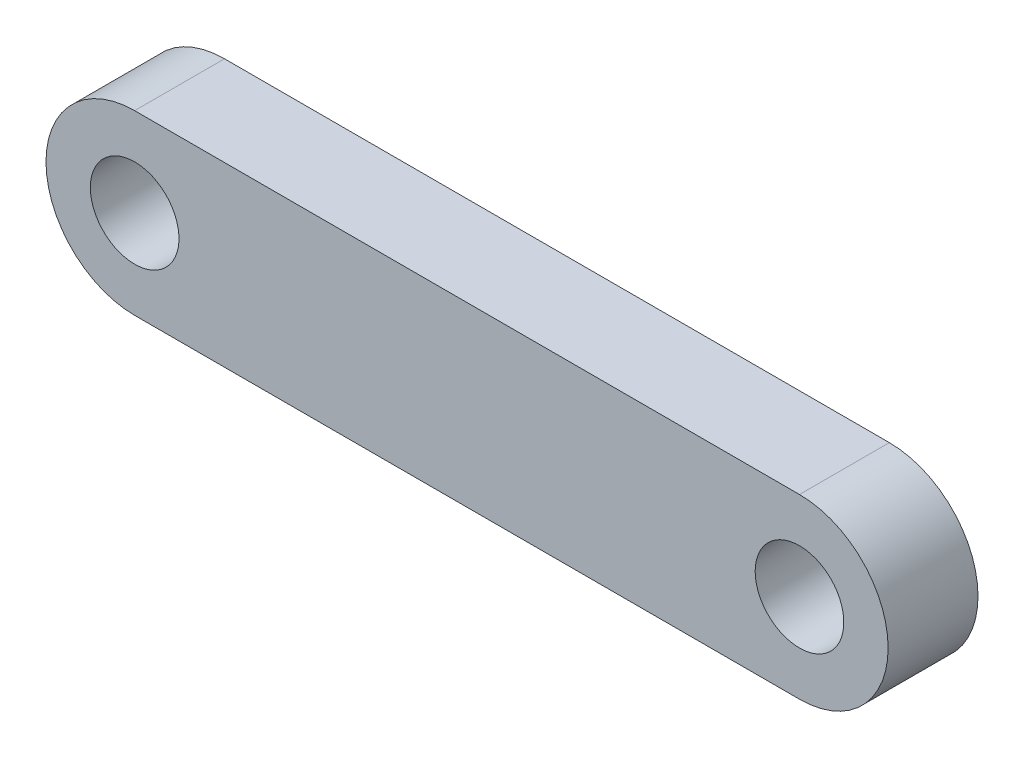
ISO-10303-21;
HEADER;
FILE_DESCRIPTION(('STEP AP214'),'2;1');
FILE_NAME('part.step','',(''),(''),'','','');
FILE_SCHEMA(('AUTOMOTIVE_DESIGN { 1 0 10303 214 1 1 1 1 }'));
ENDSEC;
DATA;
#1=APPLICATION_CONTEXT('core data for automotive mechanical design processes');
#2=APPLICATION_PROTOCOL_DEFINITION('international standard','automotive_design',2000,#1);
#3=PRODUCT_CONTEXT('',#1,'mechanical');
#4=PRODUCT('Part','Part','',(#3));
#5=PRODUCT_RELATED_PRODUCT_CATEGORY('part','',(#4));
#6=PRODUCT_DEFINITION_FORMATION('','',#4);
#7=PRODUCT_DEFINITION_CONTEXT('part definition',#1,'design');
#8=PRODUCT_DEFINITION('design','',#6,#7);
#9=PRODUCT_DEFINITION_SHAPE('','',#8);
#10=(LENGTH_UNIT() NAMED_UNIT(*) SI_UNIT(.MILLI.,.METRE.));
#11=(NAMED_UNIT(*) PLANE_ANGLE_UNIT() SI_UNIT($,.RADIAN.));
#12=(NAMED_UNIT(*) SI_UNIT($,.STERADIAN.) SOLID_ANGLE_UNIT());
#13=UNCERTAINTY_MEASURE_WITH_UNIT(LENGTH_MEASURE(1.E-05),#10,'distance_accuracy_value','');
#14=(GEOMETRIC_REPRESENTATION_CONTEXT(3) GLOBAL_UNCERTAINTY_ASSIGNED_CONTEXT((#13)) GLOBAL_UNIT_ASSIGNED_CONTEXT((#10,
#11,#12)) REPRESENTATION_CONTEXT('',''));
#15=CARTESIAN_POINT('',(0.,0.,0.));
#16=DIRECTION('',(0.,0.,1.));
#17=DIRECTION('',(1.,0.,0.));
#18=AXIS2_PLACEMENT_3D('',#15,#16,#17);
#19=CARTESIAN_POINT('',(-9.525,0.,2.575));
#20=DIRECTION('',(0.,0.,1.));
#21=DIRECTION('',(1.,0.,0.));
#22=AXIS2_PLACEMENT_3D('',#19,#20,#21);
#23=PLANE('',#22);
#24=CARTESIAN_POINT('',(-9.525,0.,2.575));
#25=DIRECTION('',(0.,0.,1.));
#26=DIRECTION('',(1.,0.,0.));
#27=AXIS2_PLACEMENT_3D('',#24,#25,#26);
#28=CIRCLE('',#27,1.27);
#29=CARTESIAN_POINT('',(-10.795,0.,2.575));
#30=VERTEX_POINT('',#29);
#31=EDGE_CURVE('E100',#30,#30,#28,.T.);
#32=ORIENTED_EDGE('',*,*,#31,.F.);
#33=EDGE_LOOP('',(#32));
#34=FACE_BOUND('',#33,.T.);
#35=CARTESIAN_POINT('',(-9.525,0.,2.575));
#36=DIRECTION('',(0.,0.,1.));
#37=DIRECTION('',(1.,0.,0.));
#38=AXIS2_PLACEMENT_3D('',#35,#36,#37);
#39=CIRCLE('',#38,2.54000000000001);
#40=CARTESIAN_POINT('',(-9.525,2.54000000000001,2.575));
#41=VERTEX_POINT('',#40);
#42=CARTESIAN_POINT('',(-9.525,-2.54000000000001,2.575));
#43=VERTEX_POINT('',#42);
#44=EDGE_CURVE('E85',#41,#43,#39,.T.);
#45=ORIENTED_EDGE('',*,*,#44,.T.);
#46=DIRECTION('',(1.,0.,0.));
#47=VECTOR('',#46,1.);
#48=CARTESIAN_POINT('',(-9.525,-2.54000000000001,2.575));
#49=LINE('',#48,#47);
#50=CARTESIAN_POINT('',(9.525,-2.54,2.575));
#51=VERTEX_POINT('',#50);
#52=EDGE_CURVE('E80',#43,#51,#49,.T.);
#53=ORIENTED_EDGE('',*,*,#52,.T.);
#54=CARTESIAN_POINT('',(9.525,0.,2.575));
#55=DIRECTION('',(0.,0.,1.));
#56=DIRECTION('',(1.,0.,0.));
#57=AXIS2_PLACEMENT_3D('',#54,#55,#56);
#58=CIRCLE('',#57,2.54000000000001);
#59=CARTESIAN_POINT('',(9.525,2.54000000000001,2.575));
#60=VERTEX_POINT('',#59);
#61=EDGE_CURVE('E83',#51,#60,#58,.T.);
#62=ORIENTED_EDGE('',*,*,#61,.T.);
#63=DIRECTION('',(-1.,0.,0.));
#64=VECTOR('',#63,1.);
#65=CARTESIAN_POINT('',(-9.525,2.54000000000001,2.575));
#66=LINE('',#65,#64);
#67=EDGE_CURVE('E50',#60,#41,#66,.T.);
#68=ORIENTED_EDGE('',*,*,#67,.T.);
#69=EDGE_LOOP('',(#45,#53,#62,#68));
#70=FACE_BOUND('',#69,.T.);
#71=CARTESIAN_POINT('',(9.525,0.,2.575));
#72=DIRECTION('',(0.,0.,1.));
#73=DIRECTION('',(1.,0.,0.));
#74=AXIS2_PLACEMENT_3D('',#71,#72,#73);
#75=CIRCLE('',#74,1.27);
#76=CARTESIAN_POINT('',(8.255,0.,2.575));
#77=VERTEX_POINT('',#76);
#78=EDGE_CURVE('E115',#77,#77,#75,.T.);
#79=ORIENTED_EDGE('',*,*,#78,.F.);
#80=EDGE_LOOP('',(#79));
#81=FACE_BOUND('',#80,.T.);
#82=ADVANCED_FACE('F33',(#34,#70,#81),#23,.T.);
#83=CARTESIAN_POINT('',(-9.525,0.,0.));
#84=DIRECTION('',(0.,0.,1.));
#85=DIRECTION('',(1.,0.,0.));
#86=AXIS2_PLACEMENT_3D('',#83,#84,#85);
#87=PLANE('',#86);
#88=CARTESIAN_POINT('',(-9.525,0.,0.));
#89=DIRECTION('',(0.,0.,1.));
#90=DIRECTION('',(1.,0.,0.));
#91=AXIS2_PLACEMENT_3D('',#88,#89,#90);
#92=CIRCLE('',#91,1.27);
#93=CARTESIAN_POINT('',(-10.795,0.,0.));
#94=VERTEX_POINT('',#93);
#95=EDGE_CURVE('E112',#94,#94,#92,.T.);
#96=ORIENTED_EDGE('',*,*,#95,.T.);
#97=EDGE_LOOP('',(#96));
#98=FACE_BOUND('',#97,.T.);
#99=CARTESIAN_POINT('',(-9.525,0.,0.));
#100=DIRECTION('',(0.,0.,1.));
#101=DIRECTION('',(1.,0.,0.));
#102=AXIS2_PLACEMENT_3D('',#99,#100,#101);
#103=CIRCLE('',#102,2.54000000000001);
#104=CARTESIAN_POINT('',(-9.525,2.54000000000001,0.));
#105=VERTEX_POINT('',#104);
#106=CARTESIAN_POINT('',(-9.525,-2.54000000000001,0.));
#107=VERTEX_POINT('',#106);
#108=EDGE_CURVE('E97',#105,#107,#103,.T.);
#109=ORIENTED_EDGE('',*,*,#108,.F.);
#110=DIRECTION('',(-1.,0.,0.));
#111=VECTOR('',#110,1.);
#112=CARTESIAN_POINT('',(-9.525,2.54000000000001,0.));
#113=LINE('',#112,#111);
#114=CARTESIAN_POINT('',(9.525,2.54000000000001,0.));
#115=VERTEX_POINT('',#114);
#116=EDGE_CURVE('E73',#115,#105,#113,.T.);
#117=ORIENTED_EDGE('',*,*,#116,.F.);
#118=CARTESIAN_POINT('',(9.525,0.,0.));
#119=DIRECTION('',(0.,0.,1.));
#120=DIRECTION('',(1.,0.,0.));
#121=AXIS2_PLACEMENT_3D('',#118,#119,#120);
#122=CIRCLE('',#121,2.54000000000001);
#123=CARTESIAN_POINT('',(9.525,-2.54,0.));
#124=VERTEX_POINT('',#123);
#125=EDGE_CURVE('E67',#124,#115,#122,.T.);
#126=ORIENTED_EDGE('',*,*,#125,.F.);
#127=DIRECTION('',(1.,0.,0.));
#128=VECTOR('',#127,1.);
#129=CARTESIAN_POINT('',(-9.525,-2.54000000000001,0.));
#130=LINE('',#129,#128);
#131=EDGE_CURVE('E89',#107,#124,#130,.T.);
#132=ORIENTED_EDGE('',*,*,#131,.F.);
#133=EDGE_LOOP('',(#109,#117,#126,#132));
#134=FACE_BOUND('',#133,.T.);
#135=CARTESIAN_POINT('',(9.525,0.,0.));
#136=DIRECTION('',(0.,0.,1.));
#137=DIRECTION('',(1.,0.,0.));
#138=AXIS2_PLACEMENT_3D('',#135,#136,#137);
#139=CIRCLE('',#138,1.27);
#140=CARTESIAN_POINT('',(8.255,0.,0.));
#141=VERTEX_POINT('',#140);
#142=EDGE_CURVE('E118',#141,#141,#139,.T.);
#143=ORIENTED_EDGE('',*,*,#142,.T.);
#144=EDGE_LOOP('',(#143));
#145=FACE_BOUND('',#144,.T.);
#146=ADVANCED_FACE('F108',(#98,#134,#145),#87,.F.);
#147=CARTESIAN_POINT('',(-9.525,0.,2.575));
#148=DIRECTION('',(0.,0.,-1.));
#149=DIRECTION('',(-1.,0.,0.));
#150=AXIS2_PLACEMENT_3D('',#147,#148,#149);
#151=CYLINDRICAL_SURFACE('',#150,2.54000000000001);
#152=ORIENTED_EDGE('',*,*,#108,.T.);
#153=DIRECTION('',(0.,0.,-1.));
#154=VECTOR('',#153,1.);
#155=CARTESIAN_POINT('',(-9.525,-2.54000000000001,2.575));
#156=LINE('',#155,#154);
#157=EDGE_CURVE('E11',#43,#107,#156,.T.);
#158=ORIENTED_EDGE('',*,*,#157,.F.);
#159=ORIENTED_EDGE('',*,*,#44,.F.);
#160=DIRECTION('',(0.,0.,-1.));
#161=VECTOR('',#160,1.);
#162=CARTESIAN_POINT('',(-9.525,2.54000000000001,2.575));
#163=LINE('',#162,#161);
#164=EDGE_CURVE('E93',#41,#105,#163,.T.);
#165=ORIENTED_EDGE('',*,*,#164,.T.);
#166=EDGE_LOOP('',(#152,#158,#159,#165));
#167=FACE_BOUND('',#166,.T.);
#168=ADVANCED_FACE('F35',(#167),#151,.T.);
#169=CARTESIAN_POINT('',(-9.525,-2.54000000000001,2.575));
#170=DIRECTION('',(0.,1.,0.));
#171=DIRECTION('',(0.,0.,1.));
#172=AXIS2_PLACEMENT_3D('',#169,#170,#171);
#173=PLANE('',#172);
#174=ORIENTED_EDGE('',*,*,#131,.T.);
#175=DIRECTION('',(0.,0.,-1.));
#176=VECTOR('',#175,1.);
#177=CARTESIAN_POINT('',(9.525,-2.54,2.575));
#178=LINE('',#177,#176);
#179=EDGE_CURVE('E42',#51,#124,#178,.T.);
#180=ORIENTED_EDGE('',*,*,#179,.F.);
#181=ORIENTED_EDGE('',*,*,#52,.F.);
#182=ORIENTED_EDGE('',*,*,#157,.T.);
#183=EDGE_LOOP('',(#174,#180,#181,#182));
#184=FACE_BOUND('',#183,.T.);
#185=ADVANCED_FACE('F88',(#184),#173,.F.);
#186=CARTESIAN_POINT('',(9.525,0.,2.575));
#187=DIRECTION('',(0.,0.,-1.));
#188=DIRECTION('',(-1.,0.,0.));
#189=AXIS2_PLACEMENT_3D('',#186,#187,#188);
#190=CYLINDRICAL_SURFACE('',#189,2.54000000000001);
#191=ORIENTED_EDGE('',*,*,#125,.T.);
#192=DIRECTION('',(0.,0.,-1.));
#193=VECTOR('',#192,1.);
#194=CARTESIAN_POINT('',(9.525,2.54000000000001,2.575));
#195=LINE('',#194,#193);
#196=EDGE_CURVE('E90',#60,#115,#195,.T.);
#197=ORIENTED_EDGE('',*,*,#196,.F.);
#198=ORIENTED_EDGE('',*,*,#61,.F.);
#199=ORIENTED_EDGE('',*,*,#179,.T.);
#200=EDGE_LOOP('',(#191,#197,#198,#199));
#201=FACE_BOUND('',#200,.T.);
#202=ADVANCED_FACE('F91',(#201),#190,.T.);
#203=CARTESIAN_POINT('',(-9.525,2.54000000000001,2.575));
#204=DIRECTION('',(0.,-1.,0.));
#205=DIRECTION('',(1.,0.,0.));
#206=AXIS2_PLACEMENT_3D('',#203,#204,#205);
#207=PLANE('',#206);
#208=ORIENTED_EDGE('',*,*,#116,.T.);
#209=ORIENTED_EDGE('',*,*,#164,.F.);
#210=ORIENTED_EDGE('',*,*,#67,.F.);
#211=ORIENTED_EDGE('',*,*,#196,.T.);
#212=EDGE_LOOP('',(#208,#209,#210,#211));
#213=FACE_BOUND('',#212,.T.);
#214=ADVANCED_FACE('F105',(#213),#207,.F.);
#215=CARTESIAN_POINT('',(-9.525,0.,2.575));
#216=DIRECTION('',(0.,0.,-1.));
#217=DIRECTION('',(-1.,0.,0.));
#218=AXIS2_PLACEMENT_3D('',#215,#216,#217);
#219=CYLINDRICAL_SURFACE('',#218,1.27);
#220=CARTESIAN_POINT('',(-10.795,0.,2.575));
#221=CARTESIAN_POINT('',(-10.795,0.,2.54817708333333));
#222=CARTESIAN_POINT('',(-10.795,0.,2.52135416666667));
#223=CARTESIAN_POINT('',(-10.795,0.,2.46770833333333));
#224=CARTESIAN_POINT('',(-10.795,0.,2.44088541666667));
#225=CARTESIAN_POINT('',(-10.795,0.,2.38723958333333));
#226=CARTESIAN_POINT('',(-10.795,0.,2.36041666666667));
#227=CARTESIAN_POINT('',(-10.795,0.,2.30677083333333));
#228=CARTESIAN_POINT('',(-10.795,0.,2.27994791666667));
#229=CARTESIAN_POINT('',(-10.795,0.,2.22630208333333));
#230=CARTESIAN_POINT('',(-10.795,0.,2.19947916666667));
#231=CARTESIAN_POINT('',(-10.795,0.,2.14583333333333));
#232=CARTESIAN_POINT('',(-10.795,0.,2.11901041666667));
#233=CARTESIAN_POINT('',(-10.795,0.,2.06536458333333));
#234=CARTESIAN_POINT('',(-10.795,0.,2.03854166666667));
#235=CARTESIAN_POINT('',(-10.795,0.,1.98489583333333));
#236=CARTESIAN_POINT('',(-10.795,0.,1.95807291666667));
#237=CARTESIAN_POINT('',(-10.795,0.,1.90442708333333));
#238=CARTESIAN_POINT('',(-10.795,0.,1.87760416666667));
#239=CARTESIAN_POINT('',(-10.795,0.,1.82395833333333));
#240=CARTESIAN_POINT('',(-10.795,0.,1.79713541666667));
#241=CARTESIAN_POINT('',(-10.795,0.,1.74348958333333));
#242=CARTESIAN_POINT('',(-10.795,0.,1.71666666666667));
#243=CARTESIAN_POINT('',(-10.795,0.,1.66302083333333));
#244=CARTESIAN_POINT('',(-10.795,0.,1.63619791666667));
#245=CARTESIAN_POINT('',(-10.795,0.,1.58255208333333));
#246=CARTESIAN_POINT('',(-10.795,0.,1.55572916666667));
#247=CARTESIAN_POINT('',(-10.795,0.,1.50208333333333));
#248=CARTESIAN_POINT('',(-10.795,0.,1.47526041666667));
#249=CARTESIAN_POINT('',(-10.795,0.,1.42161458333333));
#250=CARTESIAN_POINT('',(-10.795,0.,1.39479166666667));
#251=CARTESIAN_POINT('',(-10.795,0.,1.34114583333333));
#252=CARTESIAN_POINT('',(-10.795,0.,1.31432291666667));
#253=CARTESIAN_POINT('',(-10.795,0.,1.26067708333333));
#254=CARTESIAN_POINT('',(-10.795,0.,1.23385416666667));
#255=CARTESIAN_POINT('',(-10.795,0.,1.18020833333333));
#256=CARTESIAN_POINT('',(-10.795,0.,1.15338541666667));
#257=CARTESIAN_POINT('',(-10.795,0.,1.09973958333333));
#258=CARTESIAN_POINT('',(-10.795,0.,1.07291666666667));
#259=CARTESIAN_POINT('',(-10.795,0.,1.01927083333333));
#260=CARTESIAN_POINT('',(-10.795,0.,0.992447916666666));
#261=CARTESIAN_POINT('',(-10.795,0.,0.938802083333333));
#262=CARTESIAN_POINT('',(-10.795,0.,0.911979166666666));
#263=CARTESIAN_POINT('',(-10.795,0.,0.858333333333333));
#264=CARTESIAN_POINT('',(-10.795,0.,0.831510416666666));
#265=CARTESIAN_POINT('',(-10.795,0.,0.777864583333333));
#266=CARTESIAN_POINT('',(-10.795,0.,0.751041666666666));
#267=CARTESIAN_POINT('',(-10.795,0.,0.697395833333333));
#268=CARTESIAN_POINT('',(-10.795,0.,0.670572916666666));
#269=CARTESIAN_POINT('',(-10.795,0.,0.616927083333333));
#270=CARTESIAN_POINT('',(-10.795,0.,0.590104166666666));
#271=CARTESIAN_POINT('',(-10.795,0.,0.536458333333333));
#272=CARTESIAN_POINT('',(-10.795,0.,0.509635416666666));
#273=CARTESIAN_POINT('',(-10.795,0.,0.455989583333333));
#274=CARTESIAN_POINT('',(-10.795,0.,0.429166666666666));
#275=CARTESIAN_POINT('',(-10.795,0.,0.375520833333333));
#276=CARTESIAN_POINT('',(-10.795,0.,0.348697916666666));
#277=CARTESIAN_POINT('',(-10.795,0.,0.295052083333333));
#278=CARTESIAN_POINT('',(-10.795,0.,0.268229166666666));
#279=CARTESIAN_POINT('',(-10.795,0.,0.214583333333333));
#280=CARTESIAN_POINT('',(-10.795,0.,0.187760416666666));
#281=CARTESIAN_POINT('',(-10.795,0.,0.134114583333333));
#282=CARTESIAN_POINT('',(-10.795,0.,0.107291666666666));
#283=CARTESIAN_POINT('',(-10.795,0.,0.0536458333333328));
#284=CARTESIAN_POINT('',(-10.795,0.,0.0268229166666662));
#285=CARTESIAN_POINT('',(-10.795,0.,0.));
#286=B_SPLINE_CURVE_WITH_KNOTS('',3,(#220,#221,#222,#223,#224,#225,#226,#227,#228,#229,#230,
#231,#232,#233,#234,#235,#236,#237,#238,#239,#240,#241,#242,#243,#244,#245,#246,#247,#248,#249,
#250,#251,#252,#253,#254,#255,#256,#257,#258,#259,#260,#261,#262,#263,#264,#265,#266,#267,#268,
#269,#270,#271,#272,#273,#274,#275,#276,#277,#278,#279,#280,#281,#282,#283,#284,#285),
.UNSPECIFIED.,.F.,.F.,(4,2,2,2,2,2,2,2,2,2,2,2,2,2,2,2,2,2,2,2,2,2,2,2,2,2,2,2,2,2,2,2,4),(0.,
0.0804687499999998,0.1609375,0.24140625,0.321875,0.40234375,0.4828125,0.56328125,0.64375,
0.72421875,0.8046875,0.88515625,0.965625,1.04609375,1.1265625,1.20703125,1.2875,1.36796875,
1.4484375,1.52890625,1.609375,1.68984375,1.7703125,1.85078125,1.93125,2.01171875,2.0921875,
2.17265625,2.253125,2.33359375,2.4140625,2.49453125,2.575),.UNSPECIFIED.);
#287=EDGE_CURVE('BSEAM136',#30,#94,#286,.T.);
#288=ORIENTED_EDGE('',*,*,#31,.T.);
#289=ORIENTED_EDGE('',*,*,#95,.F.);
#290=ORIENTED_EDGE('',*,*,#287,.T.);
#291=ORIENTED_EDGE('',*,*,#287,.F.);
#292=EDGE_LOOP('',(#288,#290,#289,#291));
#293=FACE_BOUND('',#292,.T.);
#294=ADVANCED_FACE('F136',(#293),#219,.F.);
#295=CARTESIAN_POINT('',(9.525,0.,2.575));
#296=DIRECTION('',(0.,0.,-1.));
#297=DIRECTION('',(-1.,0.,0.));
#298=AXIS2_PLACEMENT_3D('',#295,#296,#297);
#299=CYLINDRICAL_SURFACE('',#298,1.27);
#300=CARTESIAN_POINT('',(8.255,0.,2.575));
#301=CARTESIAN_POINT('',(8.255,0.,2.54817708333333));
#302=CARTESIAN_POINT('',(8.255,0.,2.52135416666667));
#303=CARTESIAN_POINT('',(8.255,0.,2.46770833333333));
#304=CARTESIAN_POINT('',(8.255,0.,2.44088541666667));
#305=CARTESIAN_POINT('',(8.255,0.,2.38723958333333));
#306=CARTESIAN_POINT('',(8.255,0.,2.36041666666667));
#307=CARTESIAN_POINT('',(8.255,0.,2.30677083333333));
#308=CARTESIAN_POINT('',(8.255,0.,2.27994791666667));
#309=CARTESIAN_POINT('',(8.255,0.,2.22630208333333));
#310=CARTESIAN_POINT('',(8.255,0.,2.19947916666667));
#311=CARTESIAN_POINT('',(8.255,0.,2.14583333333333));
#312=CARTESIAN_POINT('',(8.255,0.,2.11901041666667));
#313=CARTESIAN_POINT('',(8.255,0.,2.06536458333333));
#314=CARTESIAN_POINT('',(8.255,0.,2.03854166666667));
#315=CARTESIAN_POINT('',(8.255,0.,1.98489583333333));
#316=CARTESIAN_POINT('',(8.255,0.,1.95807291666667));
#317=CARTESIAN_POINT('',(8.255,0.,1.90442708333333));
#318=CARTESIAN_POINT('',(8.255,0.,1.87760416666667));
#319=CARTESIAN_POINT('',(8.255,0.,1.82395833333333));
#320=CARTESIAN_POINT('',(8.255,0.,1.79713541666667));
#321=CARTESIAN_POINT('',(8.255,0.,1.74348958333333));
#322=CARTESIAN_POINT('',(8.255,0.,1.71666666666667));
#323=CARTESIAN_POINT('',(8.255,0.,1.66302083333333));
#324=CARTESIAN_POINT('',(8.255,0.,1.63619791666667));
#325=CARTESIAN_POINT('',(8.255,0.,1.58255208333333));
#326=CARTESIAN_POINT('',(8.255,0.,1.55572916666667));
#327=CARTESIAN_POINT('',(8.255,0.,1.50208333333333));
#328=CARTESIAN_POINT('',(8.255,0.,1.47526041666667));
#329=CARTESIAN_POINT('',(8.255,0.,1.42161458333333));
#330=CARTESIAN_POINT('',(8.255,0.,1.39479166666667));
#331=CARTESIAN_POINT('',(8.255,0.,1.34114583333333));
#332=CARTESIAN_POINT('',(8.255,0.,1.31432291666667));
#333=CARTESIAN_POINT('',(8.255,0.,1.26067708333333));
#334=CARTESIAN_POINT('',(8.255,0.,1.23385416666667));
#335=CARTESIAN_POINT('',(8.255,0.,1.18020833333333));
#336=CARTESIAN_POINT('',(8.255,0.,1.15338541666667));
#337=CARTESIAN_POINT('',(8.255,0.,1.09973958333333));
#338=CARTESIAN_POINT('',(8.255,0.,1.07291666666667));
#339=CARTESIAN_POINT('',(8.255,0.,1.01927083333333));
#340=CARTESIAN_POINT('',(8.255,0.,0.992447916666666));
#341=CARTESIAN_POINT('',(8.255,0.,0.938802083333333));
#342=CARTESIAN_POINT('',(8.255,0.,0.911979166666666));
#343=CARTESIAN_POINT('',(8.255,0.,0.858333333333333));
#344=CARTESIAN_POINT('',(8.255,0.,0.831510416666666));
#345=CARTESIAN_POINT('',(8.255,0.,0.777864583333333));
#346=CARTESIAN_POINT('',(8.255,0.,0.751041666666666));
#347=CARTESIAN_POINT('',(8.255,0.,0.697395833333333));
#348=CARTESIAN_POINT('',(8.255,0.,0.670572916666666));
#349=CARTESIAN_POINT('',(8.255,0.,0.616927083333333));
#350=CARTESIAN_POINT('',(8.255,0.,0.590104166666666));
#351=CARTESIAN_POINT('',(8.255,0.,0.536458333333333));
#352=CARTESIAN_POINT('',(8.255,0.,0.509635416666666));
#353=CARTESIAN_POINT('',(8.255,0.,0.455989583333333));
#354=CARTESIAN_POINT('',(8.255,0.,0.429166666666666));
#355=CARTESIAN_POINT('',(8.255,0.,0.375520833333333));
#356=CARTESIAN_POINT('',(8.255,0.,0.348697916666666));
#357=CARTESIAN_POINT('',(8.255,0.,0.295052083333333));
#358=CARTESIAN_POINT('',(8.255,0.,0.268229166666666));
#359=CARTESIAN_POINT('',(8.255,0.,0.214583333333333));
#360=CARTESIAN_POINT('',(8.255,0.,0.187760416666666));
#361=CARTESIAN_POINT('',(8.255,0.,0.134114583333333));
#362=CARTESIAN_POINT('',(8.255,0.,0.107291666666666));
#363=CARTESIAN_POINT('',(8.255,0.,0.0536458333333328));
#364=CARTESIAN_POINT('',(8.255,0.,0.0268229166666662));
#365=CARTESIAN_POINT('',(8.255,0.,0.));
#366=B_SPLINE_CURVE_WITH_KNOTS('',3,(#300,#301,#302,#303,#304,#305,#306,#307,#308,#309,#310,
#311,#312,#313,#314,#315,#316,#317,#318,#319,#320,#321,#322,#323,#324,#325,#326,#327,#328,#329,
#330,#331,#332,#333,#334,#335,#336,#337,#338,#339,#340,#341,#342,#343,#344,#345,#346,#347,#348,
#349,#350,#351,#352,#353,#354,#355,#356,#357,#358,#359,#360,#361,#362,#363,#364,#365),
.UNSPECIFIED.,.F.,.F.,(4,2,2,2,2,2,2,2,2,2,2,2,2,2,2,2,2,2,2,2,2,2,2,2,2,2,2,2,2,2,2,2,4),(0.,
0.0804687499999998,0.1609375,0.24140625,0.321875,0.40234375,0.4828125,0.56328125,0.64375,
0.72421875,0.8046875,0.88515625,0.965625,1.04609375,1.1265625,1.20703125,1.2875,1.36796875,
1.4484375,1.52890625,1.609375,1.68984375,1.7703125,1.85078125,1.93125,2.01171875,2.0921875,
2.17265625,2.253125,2.33359375,2.4140625,2.49453125,2.575),.UNSPECIFIED.);
#367=EDGE_CURVE('BSEAM124',#77,#141,#366,.T.);
#368=ORIENTED_EDGE('',*,*,#78,.T.);
#369=ORIENTED_EDGE('',*,*,#142,.F.);
#370=ORIENTED_EDGE('',*,*,#367,.T.);
#371=ORIENTED_EDGE('',*,*,#367,.F.);
#372=EDGE_LOOP('',(#368,#370,#369,#371));
#373=FACE_BOUND('',#372,.T.);
#374=ADVANCED_FACE('F124',(#373),#299,.F.);
#375=CLOSED_SHELL('',(#82,#146,#168,#185,#202,#214,#294,#374));
#376=MANIFOLD_SOLID_BREP('B2',#375);
#377=ADVANCED_BREP_SHAPE_REPRESENTATION('',(#18,#376),#14);
#378=SHAPE_DEFINITION_REPRESENTATION(#9,#377);
ENDSEC;
END-ISO-10303-21;
